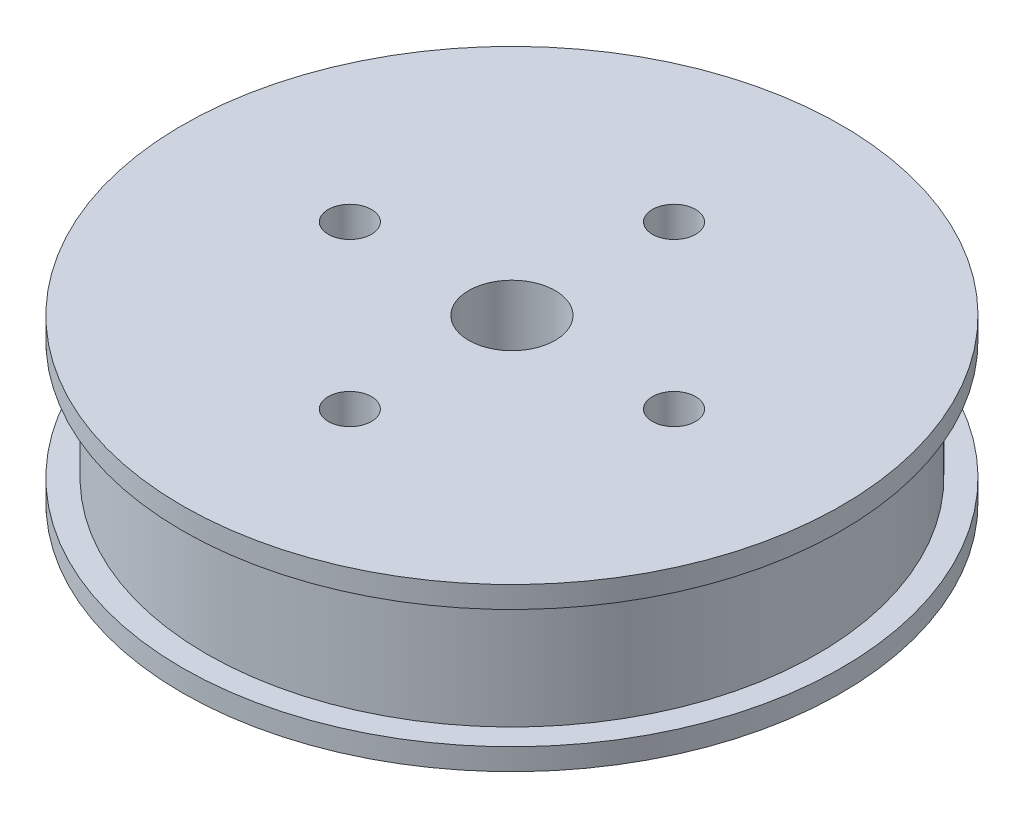
ISO-10303-21;
HEADER;
FILE_DESCRIPTION(('STEP AP214'),'2;1');
FILE_NAME('part.step','',(''),(''),'','','');
FILE_SCHEMA(('AUTOMOTIVE_DESIGN { 1 0 10303 214 1 1 1 1 }'));
ENDSEC;
DATA;
#1=APPLICATION_CONTEXT('core data for automotive mechanical design processes');
#2=APPLICATION_PROTOCOL_DEFINITION('international standard','automotive_design',2000,#1);
#3=PRODUCT_CONTEXT('',#1,'mechanical');
#4=PRODUCT('Part','Part','',(#3));
#5=PRODUCT_RELATED_PRODUCT_CATEGORY('part','',(#4));
#6=PRODUCT_DEFINITION_FORMATION('','',#4);
#7=PRODUCT_DEFINITION_CONTEXT('part definition',#1,'design');
#8=PRODUCT_DEFINITION('design','',#6,#7);
#9=PRODUCT_DEFINITION_SHAPE('','',#8);
#10=(LENGTH_UNIT() NAMED_UNIT(*) SI_UNIT(.MILLI.,.METRE.));
#11=(NAMED_UNIT(*) PLANE_ANGLE_UNIT() SI_UNIT($,.RADIAN.));
#12=(NAMED_UNIT(*) SI_UNIT($,.STERADIAN.) SOLID_ANGLE_UNIT());
#13=UNCERTAINTY_MEASURE_WITH_UNIT(LENGTH_MEASURE(1.E-05),#10,'distance_accuracy_value','');
#14=(GEOMETRIC_REPRESENTATION_CONTEXT(3) GLOBAL_UNCERTAINTY_ASSIGNED_CONTEXT((#13)) GLOBAL_UNIT_ASSIGNED_CONTEXT((#10,
#11,#12)) REPRESENTATION_CONTEXT('',''));
#15=CARTESIAN_POINT('',(0.,0.,0.));
#16=DIRECTION('',(0.,0.,1.));
#17=DIRECTION('',(1.,0.,0.));
#18=AXIS2_PLACEMENT_3D('',#15,#16,#17);
#19=CARTESIAN_POINT('',(0.,15.,0.));
#20=DIRECTION('',(0.,-1.,0.));
#21=DIRECTION('',(0.,0.,-1.));
#22=AXIS2_PLACEMENT_3D('',#19,#20,#21);
#23=CYLINDRICAL_SURFACE('',#22,30.5);
#24=CARTESIAN_POINT('',(0.,0.,0.));
#25=DIRECTION('',(0.,1.,0.));
#26=DIRECTION('',(0.,0.,1.));
#27=AXIS2_PLACEMENT_3D('',#24,#25,#26);
#28=CIRCLE('',#27,30.5);
#29=CARTESIAN_POINT('',(0.,0.,30.5));
#30=VERTEX_POINT('',#29);
#31=EDGE_CURVE('E37',#30,#30,#28,.T.);
#32=ORIENTED_EDGE('',*,*,#31,.T.);
#33=EDGE_LOOP('',(#32));
#34=FACE_BOUND('',#33,.T.);
#35=CARTESIAN_POINT('',(0.,2.,0.));
#36=DIRECTION('',(0.,1.,0.));
#37=DIRECTION('',(0.,0.,1.));
#38=AXIS2_PLACEMENT_3D('',#35,#36,#37);
#39=CIRCLE('',#38,30.5);
#40=CARTESIAN_POINT('',(0.,2.,30.5));
#41=VERTEX_POINT('',#40);
#42=EDGE_CURVE('E76',#41,#41,#39,.T.);
#43=ORIENTED_EDGE('',*,*,#42,.F.);
#44=EDGE_LOOP('',(#43));
#45=FACE_BOUND('',#44,.T.);
#46=ADVANCED_FACE('F33',(#34,#45),#23,.T.);
#47=CARTESIAN_POINT('',(0.,15.,0.));
#48=DIRECTION('',(0.,1.,0.));
#49=DIRECTION('',(0.,0.,1.));
#50=AXIS2_PLACEMENT_3D('',#47,#48,#49);
#51=PLANE('',#50);
#52=CARTESIAN_POINT('',(9.90167404567338E-13,15.,15.));
#53=DIRECTION('',(0.,1.,0.));
#54=DIRECTION('',(0.,0.,1.));
#55=AXIS2_PLACEMENT_3D('',#52,#53,#54);
#56=CIRCLE('',#55,2.);
#57=CARTESIAN_POINT('',(9.90167404567338E-13,15.,17.));
#58=VERTEX_POINT('',#57);
#59=EDGE_CURVE('E61',#58,#58,#56,.T.);
#60=ORIENTED_EDGE('',*,*,#59,.F.);
#61=EDGE_LOOP('',(#60));
#62=FACE_BOUND('',#61,.T.);
#63=CARTESIAN_POINT('',(0.,15.,-15.));
#64=DIRECTION('',(0.,1.,0.));
#65=DIRECTION('',(0.,0.,1.));
#66=AXIS2_PLACEMENT_3D('',#63,#64,#65);
#67=CIRCLE('',#66,2.);
#68=CARTESIAN_POINT('',(0.,15.,-13.));
#69=VERTEX_POINT('',#68);
#70=EDGE_CURVE('E49',#69,#69,#67,.T.);
#71=ORIENTED_EDGE('',*,*,#70,.F.);
#72=EDGE_LOOP('',(#71));
#73=FACE_BOUND('',#72,.T.);
#74=CARTESIAN_POINT('',(0.,15.,0.));
#75=DIRECTION('',(0.,1.,0.));
#76=DIRECTION('',(0.,0.,1.));
#77=AXIS2_PLACEMENT_3D('',#74,#75,#76);
#78=CIRCLE('',#77,30.5);
#79=CARTESIAN_POINT('',(0.,15.,30.5));
#80=VERTEX_POINT('',#79);
#81=EDGE_CURVE('E10',#80,#80,#78,.T.);
#82=ORIENTED_EDGE('',*,*,#81,.T.);
#83=EDGE_LOOP('',(#82));
#84=FACE_BOUND('',#83,.T.);
#85=CARTESIAN_POINT('',(0.,15.,0.));
#86=DIRECTION('',(0.,1.,0.));
#87=DIRECTION('',(0.,0.,1.));
#88=AXIS2_PLACEMENT_3D('',#85,#86,#87);
#89=CIRCLE('',#88,4.);
#90=CARTESIAN_POINT('',(0.,15.,4.));
#91=VERTEX_POINT('',#90);
#92=EDGE_CURVE('E44',#91,#91,#89,.T.);
#93=ORIENTED_EDGE('',*,*,#92,.F.);
#94=EDGE_LOOP('',(#93));
#95=FACE_BOUND('',#94,.T.);
#96=CARTESIAN_POINT('',(15.0000000000005,15.,-4.95083702283669E-13));
#97=DIRECTION('',(0.,1.,0.));
#98=DIRECTION('',(0.,0.,1.));
#99=AXIS2_PLACEMENT_3D('',#96,#97,#98);
#100=CIRCLE('',#99,2.);
#101=CARTESIAN_POINT('',(15.0000000000005,15.,1.99999999999951));
#102=VERTEX_POINT('',#101);
#103=EDGE_CURVE('E55',#102,#102,#100,.T.);
#104=ORIENTED_EDGE('',*,*,#103,.F.);
#105=EDGE_LOOP('',(#104));
#106=FACE_BOUND('',#105,.T.);
#107=CARTESIAN_POINT('',(-14.9999999999995,15.,4.9692067248239E-13));
#108=DIRECTION('',(0.,1.,0.));
#109=DIRECTION('',(0.,0.,1.));
#110=AXIS2_PLACEMENT_3D('',#107,#108,#109);
#111=CIRCLE('',#110,2.);
#112=CARTESIAN_POINT('',(-14.9999999999995,15.,2.0000000000005));
#113=VERTEX_POINT('',#112);
#114=EDGE_CURVE('E67',#113,#113,#111,.T.);
#115=ORIENTED_EDGE('',*,*,#114,.F.);
#116=EDGE_LOOP('',(#115));
#117=FACE_BOUND('',#116,.T.);
#118=ADVANCED_FACE('F108',(#62,#73,#84,#95,#106,#117),#51,.T.);
#119=CARTESIAN_POINT('',(0.,0.,0.));
#120=DIRECTION('',(0.,1.,0.));
#121=DIRECTION('',(0.,0.,1.));
#122=AXIS2_PLACEMENT_3D('',#119,#120,#121);
#123=PLANE('',#122);
#124=ORIENTED_EDGE('',*,*,#31,.F.);
#125=EDGE_LOOP('',(#124));
#126=FACE_BOUND('',#125,.T.);
#127=CARTESIAN_POINT('',(0.,0.,0.));
#128=DIRECTION('',(0.,1.,0.));
#129=DIRECTION('',(0.,0.,1.));
#130=AXIS2_PLACEMENT_3D('',#127,#128,#129);
#131=CIRCLE('',#130,4.);
#132=CARTESIAN_POINT('',(0.,0.,4.));
#133=VERTEX_POINT('',#132);
#134=EDGE_CURVE('E46',#133,#133,#131,.T.);
#135=ORIENTED_EDGE('',*,*,#134,.T.);
#136=EDGE_LOOP('',(#135));
#137=FACE_BOUND('',#136,.T.);
#138=CARTESIAN_POINT('',(0.,0.,-15.));
#139=DIRECTION('',(0.,1.,0.));
#140=DIRECTION('',(0.,0.,1.));
#141=AXIS2_PLACEMENT_3D('',#138,#139,#140);
#142=CIRCLE('',#141,2.);
#143=CARTESIAN_POINT('',(0.,0.,-13.));
#144=VERTEX_POINT('',#143);
#145=EDGE_CURVE('E52',#144,#144,#142,.T.);
#146=ORIENTED_EDGE('',*,*,#145,.T.);
#147=EDGE_LOOP('',(#146));
#148=FACE_BOUND('',#147,.T.);
#149=CARTESIAN_POINT('',(15.0000000000005,0.,-4.95083702283669E-13));
#150=DIRECTION('',(0.,1.,0.));
#151=DIRECTION('',(0.,0.,1.));
#152=AXIS2_PLACEMENT_3D('',#149,#150,#151);
#153=CIRCLE('',#152,2.);
#154=CARTESIAN_POINT('',(15.0000000000005,0.,1.99999999999951));
#155=VERTEX_POINT('',#154);
#156=EDGE_CURVE('E58',#155,#155,#153,.T.);
#157=ORIENTED_EDGE('',*,*,#156,.T.);
#158=EDGE_LOOP('',(#157));
#159=FACE_BOUND('',#158,.T.);
#160=CARTESIAN_POINT('',(9.90167404567338E-13,0.,15.));
#161=DIRECTION('',(0.,1.,0.));
#162=DIRECTION('',(0.,0.,1.));
#163=AXIS2_PLACEMENT_3D('',#160,#161,#162);
#164=CIRCLE('',#163,2.);
#165=CARTESIAN_POINT('',(9.90167404567338E-13,0.,17.));
#166=VERTEX_POINT('',#165);
#167=EDGE_CURVE('E64',#166,#166,#164,.T.);
#168=ORIENTED_EDGE('',*,*,#167,.T.);
#169=EDGE_LOOP('',(#168));
#170=FACE_BOUND('',#169,.T.);
#171=CARTESIAN_POINT('',(-14.9999999999995,0.,4.9692067248239E-13));
#172=DIRECTION('',(0.,1.,0.));
#173=DIRECTION('',(0.,0.,1.));
#174=AXIS2_PLACEMENT_3D('',#171,#172,#173);
#175=CIRCLE('',#174,2.);
#176=CARTESIAN_POINT('',(-14.9999999999995,0.,2.0000000000005));
#177=VERTEX_POINT('',#176);
#178=EDGE_CURVE('E70',#177,#177,#175,.T.);
#179=ORIENTED_EDGE('',*,*,#178,.T.);
#180=EDGE_LOOP('',(#179));
#181=FACE_BOUND('',#180,.T.);
#182=ADVANCED_FACE('F113',(#126,#137,#148,#159,#170,#181),#123,.F.);
#183=CARTESIAN_POINT('',(0.,13.,0.));
#184=DIRECTION('',(0.,1.,0.));
#185=DIRECTION('',(0.,0.,1.));
#186=AXIS2_PLACEMENT_3D('',#183,#184,#185);
#187=CIRCLE('',#186,30.5);
#188=CARTESIAN_POINT('',(0.,13.,30.5));
#189=VERTEX_POINT('',#188);
#190=EDGE_CURVE('E73',#189,#189,#187,.T.);
#191=ORIENTED_EDGE('',*,*,#190,.T.);
#192=EDGE_LOOP('',(#191));
#193=FACE_BOUND('',#192,.T.);
#194=ORIENTED_EDGE('',*,*,#81,.F.);
#195=EDGE_LOOP('',(#194));
#196=FACE_BOUND('',#195,.T.);
#197=ADVANCED_FACE('F35',(#193,#196),#23,.T.);
#198=CARTESIAN_POINT('',(0.,15.,0.));
#199=DIRECTION('',(0.,-1.,0.));
#200=DIRECTION('',(0.,0.,-1.));
#201=AXIS2_PLACEMENT_3D('',#198,#199,#200);
#202=CYLINDRICAL_SURFACE('',#201,4.);
#203=ORIENTED_EDGE('',*,*,#92,.T.);
#204=EDGE_LOOP('',(#203));
#205=FACE_BOUND('',#204,.T.);
#206=ORIENTED_EDGE('',*,*,#134,.F.);
#207=EDGE_LOOP('',(#206));
#208=FACE_BOUND('',#207,.T.);
#209=ADVANCED_FACE('F118',(#205,#208),#202,.F.);
#210=CARTESIAN_POINT('',(0.,15.,-15.));
#211=DIRECTION('',(0.,-1.,0.));
#212=DIRECTION('',(0.,0.,-1.));
#213=AXIS2_PLACEMENT_3D('',#210,#211,#212);
#214=CYLINDRICAL_SURFACE('',#213,2.);
#215=ORIENTED_EDGE('',*,*,#70,.T.);
#216=EDGE_LOOP('',(#215));
#217=FACE_BOUND('',#216,.T.);
#218=ORIENTED_EDGE('',*,*,#145,.F.);
#219=EDGE_LOOP('',(#218));
#220=FACE_BOUND('',#219,.T.);
#221=ADVANCED_FACE('F124',(#217,#220),#214,.F.);
#222=CARTESIAN_POINT('',(15.0000000000005,15.,-4.95083702283669E-13));
#223=DIRECTION('',(0.,-1.,0.));
#224=DIRECTION('',(0.,0.,-1.));
#225=AXIS2_PLACEMENT_3D('',#222,#223,#224);
#226=CYLINDRICAL_SURFACE('',#225,2.);
#227=ORIENTED_EDGE('',*,*,#103,.T.);
#228=EDGE_LOOP('',(#227));
#229=FACE_BOUND('',#228,.T.);
#230=ORIENTED_EDGE('',*,*,#156,.F.);
#231=EDGE_LOOP('',(#230));
#232=FACE_BOUND('',#231,.T.);
#233=ADVANCED_FACE('F137',(#229,#232),#226,.F.);
#234=CARTESIAN_POINT('',(9.90167404567338E-13,15.,15.));
#235=DIRECTION('',(0.,-1.,0.));
#236=DIRECTION('',(0.,0.,-1.));
#237=AXIS2_PLACEMENT_3D('',#234,#235,#236);
#238=CYLINDRICAL_SURFACE('',#237,2.);
#239=ORIENTED_EDGE('',*,*,#59,.T.);
#240=EDGE_LOOP('',(#239));
#241=FACE_BOUND('',#240,.T.);
#242=ORIENTED_EDGE('',*,*,#167,.F.);
#243=EDGE_LOOP('',(#242));
#244=FACE_BOUND('',#243,.T.);
#245=ADVANCED_FACE('F141',(#241,#244),#238,.F.);
#246=CARTESIAN_POINT('',(-14.9999999999995,15.,4.9692067248239E-13));
#247=DIRECTION('',(0.,-1.,0.));
#248=DIRECTION('',(0.,0.,-1.));
#249=AXIS2_PLACEMENT_3D('',#246,#247,#248);
#250=CYLINDRICAL_SURFACE('',#249,2.);
#251=ORIENTED_EDGE('',*,*,#114,.T.);
#252=EDGE_LOOP('',(#251));
#253=FACE_BOUND('',#252,.T.);
#254=ORIENTED_EDGE('',*,*,#178,.F.);
#255=EDGE_LOOP('',(#254));
#256=FACE_BOUND('',#255,.T.);
#257=ADVANCED_FACE('F103',(#253,#256),#250,.F.);
#258=CARTESIAN_POINT('',(0.,13.,0.));
#259=DIRECTION('',(0.,1.,0.));
#260=DIRECTION('',(0.,0.,1.));
#261=AXIS2_PLACEMENT_3D('',#258,#259,#260);
#262=PLANE('',#261);
#263=ORIENTED_EDGE('',*,*,#190,.F.);
#264=EDGE_LOOP('',(#263));
#265=FACE_BOUND('',#264,.T.);
#266=CARTESIAN_POINT('',(0.,13.,0.));
#267=DIRECTION('',(0.,1.,0.));
#268=DIRECTION('',(0.,0.,1.));
#269=AXIS2_PLACEMENT_3D('',#266,#267,#268);
#270=CIRCLE('',#269,28.265);
#271=CARTESIAN_POINT('',(0.,13.,28.265));
#272=VERTEX_POINT('',#271);
#273=EDGE_CURVE('E79',#272,#272,#270,.T.);
#274=ORIENTED_EDGE('',*,*,#273,.T.);
#275=EDGE_LOOP('',(#274));
#276=FACE_BOUND('',#275,.T.);
#277=ADVANCED_FACE('F88',(#265,#276),#262,.F.);
#278=CARTESIAN_POINT('',(0.,2.,0.));
#279=DIRECTION('',(0.,1.,0.));
#280=DIRECTION('',(0.,0.,1.));
#281=AXIS2_PLACEMENT_3D('',#278,#279,#280);
#282=PLANE('',#281);
#283=ORIENTED_EDGE('',*,*,#42,.T.);
#284=EDGE_LOOP('',(#283));
#285=FACE_BOUND('',#284,.T.);
#286=CARTESIAN_POINT('',(0.,2.,0.));
#287=DIRECTION('',(0.,1.,0.));
#288=DIRECTION('',(0.,0.,1.));
#289=AXIS2_PLACEMENT_3D('',#286,#287,#288);
#290=CIRCLE('',#289,28.265);
#291=CARTESIAN_POINT('',(0.,2.,28.265));
#292=VERTEX_POINT('',#291);
#293=EDGE_CURVE('E82',#292,#292,#290,.T.);
#294=ORIENTED_EDGE('',*,*,#293,.F.);
#295=EDGE_LOOP('',(#294));
#296=FACE_BOUND('',#295,.T.);
#297=ADVANCED_FACE('F93',(#285,#296),#282,.T.);
#298=CARTESIAN_POINT('',(0.,13.,0.));
#299=DIRECTION('',(0.,-1.,0.));
#300=DIRECTION('',(0.,0.,-1.));
#301=AXIS2_PLACEMENT_3D('',#298,#299,#300);
#302=CYLINDRICAL_SURFACE('',#301,28.265);
#303=ORIENTED_EDGE('',*,*,#273,.F.);
#304=EDGE_LOOP('',(#303));
#305=FACE_BOUND('',#304,.T.);
#306=ORIENTED_EDGE('',*,*,#293,.T.);
#307=EDGE_LOOP('',(#306));
#308=FACE_BOUND('',#307,.T.);
#309=ADVANCED_FACE('F90',(#305,#308),#302,.T.);
#310=CLOSED_SHELL('',(#46,#118,#182,#197,#209,#221,#233,#245,#257,#277,#297,#309));
#311=MANIFOLD_SOLID_BREP('B2',#310);
#312=ADVANCED_BREP_SHAPE_REPRESENTATION('',(#18,#311),#14);
#313=SHAPE_DEFINITION_REPRESENTATION(#9,#312);
ENDSEC;
END-ISO-10303-21;
